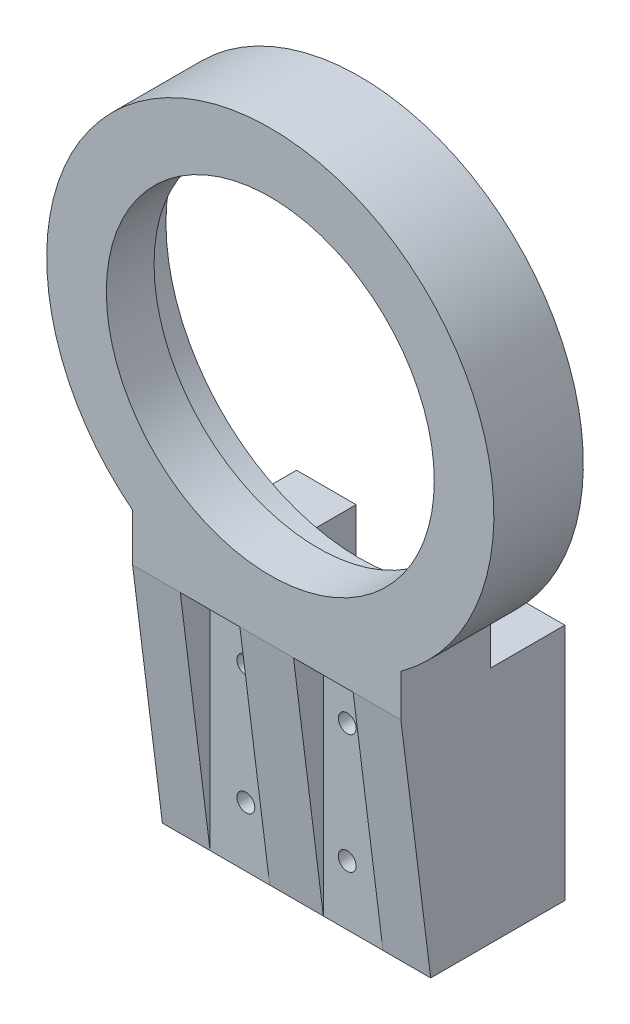
ISO-10303-21;
HEADER;
FILE_DESCRIPTION(('STEP AP214'),'2;1');
FILE_NAME('part.step','',(''),(''),'','','');
FILE_SCHEMA(('AUTOMOTIVE_DESIGN { 1 0 10303 214 1 1 1 1 }'));
ENDSEC;
DATA;
#1=APPLICATION_CONTEXT('core data for automotive mechanical design processes');
#2=APPLICATION_PROTOCOL_DEFINITION('international standard','automotive_design',2000,#1);
#3=PRODUCT_CONTEXT('',#1,'mechanical');
#4=PRODUCT('Part','Part','',(#3));
#5=PRODUCT_RELATED_PRODUCT_CATEGORY('part','',(#4));
#6=PRODUCT_DEFINITION_FORMATION('','',#4);
#7=PRODUCT_DEFINITION_CONTEXT('part definition',#1,'design');
#8=PRODUCT_DEFINITION('design','',#6,#7);
#9=PRODUCT_DEFINITION_SHAPE('','',#8);
#10=(LENGTH_UNIT() NAMED_UNIT(*) SI_UNIT(.MILLI.,.METRE.));
#11=(NAMED_UNIT(*) PLANE_ANGLE_UNIT() SI_UNIT($,.RADIAN.));
#12=(NAMED_UNIT(*) SI_UNIT($,.STERADIAN.) SOLID_ANGLE_UNIT());
#13=UNCERTAINTY_MEASURE_WITH_UNIT(LENGTH_MEASURE(1.E-05),#10,'distance_accuracy_value','');
#14=(GEOMETRIC_REPRESENTATION_CONTEXT(3) GLOBAL_UNCERTAINTY_ASSIGNED_CONTEXT((#13)) GLOBAL_UNIT_ASSIGNED_CONTEXT((#10,
#11,#12)) REPRESENTATION_CONTEXT('',''));
#15=CARTESIAN_POINT('',(0.,0.,0.));
#16=DIRECTION('',(0.,0.,1.));
#17=DIRECTION('',(1.,0.,0.));
#18=AXIS2_PLACEMENT_3D('',#15,#16,#17);
#19=CARTESIAN_POINT('',(0.,0.,0.));
#20=DIRECTION('',(0.,0.,1.));
#21=DIRECTION('',(1.,0.,0.));
#22=AXIS2_PLACEMENT_3D('',#19,#20,#21);
#23=PLANE('',#22);
#24=CARTESIAN_POINT('',(7.89839646309968,-47.5,0.));
#25=DIRECTION('',(0.,0.,1.));
#26=DIRECTION('',(1.,0.,0.));
#27=AXIS2_PLACEMENT_3D('',#24,#25,#26);
#28=CIRCLE('',#27,1.5);
#29=CARTESIAN_POINT('',(9.39839646309968,-47.5,0.));
#30=VERTEX_POINT('',#29);
#31=EDGE_CURVE('E642',#30,#30,#28,.T.);
#32=ORIENTED_EDGE('',*,*,#31,.T.);
#33=EDGE_LOOP('',(#32));
#34=FACE_BOUND('',#33,.T.);
#35=CARTESIAN_POINT('',(7.89839646309968,-67.5,0.));
#36=DIRECTION('',(0.,0.,1.));
#37=DIRECTION('',(1.,0.,0.));
#38=AXIS2_PLACEMENT_3D('',#35,#36,#37);
#39=CIRCLE('',#38,1.5);
#40=CARTESIAN_POINT('',(9.39839646309968,-67.5,0.));
#41=VERTEX_POINT('',#40);
#42=EDGE_CURVE('E670',#41,#41,#39,.T.);
#43=ORIENTED_EDGE('',*,*,#42,.T.);
#44=EDGE_LOOP('',(#43));
#45=FACE_BOUND('',#44,.T.);
#46=CARTESIAN_POINT('',(-9.10160353690032,-67.5,0.));
#47=DIRECTION('',(0.,0.,1.));
#48=DIRECTION('',(1.,0.,0.));
#49=AXIS2_PLACEMENT_3D('',#46,#47,#48);
#50=CIRCLE('',#49,1.5);
#51=CARTESIAN_POINT('',(-7.60160353690032,-67.5,0.));
#52=VERTEX_POINT('',#51);
#53=EDGE_CURVE('E657',#52,#52,#50,.T.);
#54=ORIENTED_EDGE('',*,*,#53,.T.);
#55=EDGE_LOOP('',(#54));
#56=FACE_BOUND('',#55,.T.);
#57=CARTESIAN_POINT('',(-9.10160353690032,-47.5,0.));
#58=DIRECTION('',(0.,0.,1.));
#59=DIRECTION('',(1.,0.,0.));
#60=AXIS2_PLACEMENT_3D('',#57,#58,#59);
#61=CIRCLE('',#60,1.5);
#62=CARTESIAN_POINT('',(-7.60160353690032,-47.5,0.));
#63=VERTEX_POINT('',#62);
#64=EDGE_CURVE('E652',#63,#63,#61,.T.);
#65=ORIENTED_EDGE('',*,*,#64,.T.);
#66=EDGE_LOOP('',(#65));
#67=FACE_BOUND('',#66,.T.);
#68=CARTESIAN_POINT('',(0.,0.,0.));
#69=DIRECTION('',(0.,0.,-1.));
#70=DIRECTION('',(-1.,0.,0.));
#71=AXIS2_PLACEMENT_3D('',#68,#69,#70);
#72=CIRCLE('',#71,32.5);
#73=CARTESIAN_POINT('',(-32.5,0.,0.));
#74=VERTEX_POINT('',#73);
#75=EDGE_CURVE('E262',#74,#74,#72,.T.);
#76=ORIENTED_EDGE('',*,*,#75,.F.);
#77=EDGE_LOOP('',(#76));
#78=FACE_BOUND('',#77,.T.);
#79=DIRECTION('',(1.,0.,0.));
#80=VECTOR('',#79,1.);
#81=CARTESIAN_POINT('',(-23.1016035369003,-37.5,0.));
#82=LINE('',#81,#80);
#83=CARTESIAN_POINT('',(-23.1016035369003,-37.5,0.));
#84=VERTEX_POINT('',#83);
#85=CARTESIAN_POINT('',(-13.1016035369003,-37.5,0.));
#86=VERTEX_POINT('',#85);
#87=EDGE_CURVE('E393',#84,#86,#82,.T.);
#88=ORIENTED_EDGE('',*,*,#87,.F.);
#89=DIRECTION('',(0.,1.,0.));
#90=VECTOR('',#89,1.);
#91=CARTESIAN_POINT('',(-23.1016035369003,0.,0.));
#92=LINE('',#91,#90);
#93=CARTESIAN_POINT('',(-23.1016035369003,-29.5392266998287,0.));
#94=VERTEX_POINT('',#93);
#95=EDGE_CURVE('E177',#84,#94,#92,.T.);
#96=ORIENTED_EDGE('',*,*,#95,.T.);
#97=CARTESIAN_POINT('',(0.,0.,0.));
#98=DIRECTION('',(0.,0.,1.));
#99=DIRECTION('',(1.,0.,0.));
#100=AXIS2_PLACEMENT_3D('',#97,#98,#99);
#101=CIRCLE('',#100,37.5);
#102=CARTESIAN_POINT('',(21.8983964630997,-30.4419157141088,0.));
#103=VERTEX_POINT('',#102);
#104=EDGE_CURVE('E266',#103,#94,#101,.T.);
#105=ORIENTED_EDGE('',*,*,#104,.F.);
#106=DIRECTION('',(0.,1.,0.));
#107=VECTOR('',#106,1.);
#108=CARTESIAN_POINT('',(21.8983964630997,0.,0.));
#109=LINE('',#108,#107);
#110=CARTESIAN_POINT('',(21.8983964630997,-37.5,0.));
#111=VERTEX_POINT('',#110);
#112=EDGE_CURVE('E273',#111,#103,#109,.T.);
#113=ORIENTED_EDGE('',*,*,#112,.F.);
#114=DIRECTION('',(1.,0.,0.));
#115=VECTOR('',#114,1.);
#116=CARTESIAN_POINT('',(21.8983964630997,-37.5,0.));
#117=LINE('',#116,#115);
#118=CARTESIAN_POINT('',(11.8983964630997,-37.5,0.));
#119=VERTEX_POINT('',#118);
#120=EDGE_CURVE('E181',#119,#111,#117,.T.);
#121=ORIENTED_EDGE('',*,*,#120,.F.);
#122=DIRECTION('',(0.,1.,0.));
#123=VECTOR('',#122,1.);
#124=CARTESIAN_POINT('',(11.8983964630997,-77.5,0.));
#125=LINE('',#124,#123);
#126=CARTESIAN_POINT('',(11.8983964630997,-77.5,0.));
#127=VERTEX_POINT('',#126);
#128=EDGE_CURVE('E178',#127,#119,#125,.T.);
#129=ORIENTED_EDGE('',*,*,#128,.F.);
#130=DIRECTION('',(1.,0.,0.));
#131=VECTOR('',#130,1.);
#132=CARTESIAN_POINT('',(0.,-77.5,0.));
#133=LINE('',#132,#131);
#134=CARTESIAN_POINT('',(-13.1016035369003,-77.5,0.));
#135=VERTEX_POINT('',#134);
#136=EDGE_CURVE('E54',#135,#127,#133,.T.);
#137=ORIENTED_EDGE('',*,*,#136,.F.);
#138=DIRECTION('',(0.,-1.,0.));
#139=VECTOR('',#138,1.);
#140=CARTESIAN_POINT('',(-13.1016035369003,-77.5,0.));
#141=LINE('',#140,#139);
#142=EDGE_CURVE('E171',#86,#135,#141,.T.);
#143=ORIENTED_EDGE('',*,*,#142,.F.);
#144=EDGE_LOOP('',(#88,#96,#105,#113,#121,#129,#137,#143));
#145=FACE_BOUND('',#144,.T.);
#146=ADVANCED_FACE('F34',(#34,#45,#56,#67,#78,#145),#23,.F.);
#147=CARTESIAN_POINT('',(21.8983964630997,-37.5,15.));
#148=DIRECTION('',(0.,-0.124034734589208,0.992277876713668));
#149=DIRECTION('',(0.,-0.992277876713668,-0.124034734589208));
#150=AXIS2_PLACEMENT_3D('',#147,#148,#149);
#151=PLANE('',#150);
#152=DIRECTION('',(0.,-0.992277876713668,-0.124034734589208));
#153=VECTOR('',#152,1.);
#154=CARTESIAN_POINT('',(-15.1016035369003,-37.5,15.));
#155=LINE('',#154,#153);
#156=CARTESIAN_POINT('',(-15.1016035369003,-37.5,15.));
#157=VERTEX_POINT('',#156);
#158=CARTESIAN_POINT('',(-15.1016035369003,-77.5,10.));
#159=VERTEX_POINT('',#158);
#160=EDGE_CURVE('E11',#157,#159,#155,.T.);
#161=ORIENTED_EDGE('',*,*,#160,.F.);
#162=DIRECTION('',(1.,0.,0.));
#163=VECTOR('',#162,1.);
#164=CARTESIAN_POINT('',(-23.1016035369003,-37.5,15.));
#165=LINE('',#164,#163);
#166=CARTESIAN_POINT('',(-23.1016035369003,-37.5,15.));
#167=VERTEX_POINT('',#166);
#168=EDGE_CURVE('E250',#167,#157,#165,.T.);
#169=ORIENTED_EDGE('',*,*,#168,.F.);
#170=DIRECTION('',(0.,0.992277876713668,0.124034734589208));
#171=VECTOR('',#170,1.);
#172=CARTESIAN_POINT('',(-23.1016035369003,-37.5,15.));
#173=LINE('',#172,#171);
#174=CARTESIAN_POINT('',(-23.1016035369003,-77.5,10.));
#175=VERTEX_POINT('',#174);
#176=EDGE_CURVE('E226',#175,#167,#173,.T.);
#177=ORIENTED_EDGE('',*,*,#176,.F.);
#178=DIRECTION('',(1.,0.,0.));
#179=VECTOR('',#178,1.);
#180=CARTESIAN_POINT('',(-23.1016035369003,-77.5,10.));
#181=LINE('',#180,#179);
#182=EDGE_CURVE('E256',#175,#159,#181,.T.);
#183=ORIENTED_EDGE('',*,*,#182,.T.);
#184=EDGE_LOOP('',(#161,#169,#177,#183));
#185=FACE_BOUND('',#184,.T.);
#186=ADVANCED_FACE('F321',(#185),#151,.T.);
#187=DIRECTION('',(0.,0.992277876713668,0.124034734589208));
#188=VECTOR('',#187,1.);
#189=CARTESIAN_POINT('',(-5.10160353690032,-37.5,15.));
#190=LINE('',#189,#188);
#191=CARTESIAN_POINT('',(-5.10160353690031,-77.5,10.));
#192=VERTEX_POINT('',#191);
#193=CARTESIAN_POINT('',(-5.10160353690032,-37.5,15.));
#194=VERTEX_POINT('',#193);
#195=EDGE_CURVE('E42',#192,#194,#190,.T.);
#196=ORIENTED_EDGE('',*,*,#195,.F.);
#197=CARTESIAN_POINT('',(3.89839646309969,-77.5,10.));
#198=VERTEX_POINT('',#197);
#199=EDGE_CURVE('E259',#192,#198,#181,.T.);
#200=ORIENTED_EDGE('',*,*,#199,.T.);
#201=DIRECTION('',(0.,-0.992277876713668,-0.124034734589208));
#202=VECTOR('',#201,1.);
#203=CARTESIAN_POINT('',(3.89839646309968,-37.5,15.));
#204=LINE('',#203,#202);
#205=CARTESIAN_POINT('',(3.89839646309968,-37.5,15.));
#206=VERTEX_POINT('',#205);
#207=EDGE_CURVE('E297',#206,#198,#204,.T.);
#208=ORIENTED_EDGE('',*,*,#207,.F.);
#209=EDGE_CURVE('E254',#194,#206,#165,.T.);
#210=ORIENTED_EDGE('',*,*,#209,.F.);
#211=EDGE_LOOP('',(#196,#200,#208,#210));
#212=FACE_BOUND('',#211,.T.);
#213=ADVANCED_FACE('F309',(#212),#151,.T.);
#214=CARTESIAN_POINT('',(0.,0.,15.));
#215=DIRECTION('',(0.,0.,-1.));
#216=DIRECTION('',(-1.,0.,0.));
#217=AXIS2_PLACEMENT_3D('',#214,#215,#216);
#218=CYLINDRICAL_SURFACE('',#217,27.5);
#219=CARTESIAN_POINT('',(0.,0.,15.));
#220=DIRECTION('',(0.,0.,1.));
#221=DIRECTION('',(1.,0.,0.));
#222=AXIS2_PLACEMENT_3D('',#219,#220,#221);
#223=CIRCLE('',#222,27.5);
#224=CARTESIAN_POINT('',(27.5,0.,15.));
#225=VERTEX_POINT('',#224);
#226=EDGE_CURVE('E277',#225,#225,#223,.T.);
#227=ORIENTED_EDGE('',*,*,#226,.T.);
#228=EDGE_LOOP('',(#227));
#229=FACE_BOUND('',#228,.T.);
#230=CARTESIAN_POINT('',(0.,0.,7.));
#231=DIRECTION('',(0.,0.,-1.));
#232=DIRECTION('',(-1.,0.,0.));
#233=AXIS2_PLACEMENT_3D('',#230,#231,#232);
#234=CIRCLE('',#233,27.5);
#235=CARTESIAN_POINT('',(-27.5,0.,7.));
#236=VERTEX_POINT('',#235);
#237=EDGE_CURVE('E253',#236,#236,#234,.T.);
#238=ORIENTED_EDGE('',*,*,#237,.T.);
#239=EDGE_LOOP('',(#238));
#240=FACE_BOUND('',#239,.T.);
#241=ADVANCED_FACE('F376',(#229,#240),#218,.F.);
#242=CARTESIAN_POINT('',(0.,0.,15.));
#243=DIRECTION('',(0.,0.,-1.));
#244=DIRECTION('',(-1.,0.,0.));
#245=AXIS2_PLACEMENT_3D('',#242,#243,#244);
#246=CYLINDRICAL_SURFACE('',#245,37.5);
#247=ORIENTED_EDGE('',*,*,#104,.T.);
#248=DIRECTION('',(0.,0.,-1.));
#249=VECTOR('',#248,1.);
#250=CARTESIAN_POINT('',(-23.1016035369003,-29.5392266998287,15.));
#251=LINE('',#250,#249);
#252=CARTESIAN_POINT('',(-23.1016035369003,-29.5392266998287,15.));
#253=VERTEX_POINT('',#252);
#254=EDGE_CURVE('E292',#253,#94,#251,.T.);
#255=ORIENTED_EDGE('',*,*,#254,.F.);
#256=CARTESIAN_POINT('',(0.,0.,15.));
#257=DIRECTION('',(0.,0.,1.));
#258=DIRECTION('',(1.,0.,0.));
#259=AXIS2_PLACEMENT_3D('',#256,#257,#258);
#260=CIRCLE('',#259,37.5);
#261=CARTESIAN_POINT('',(21.8983964630997,-30.4419157141088,15.));
#262=VERTEX_POINT('',#261);
#263=EDGE_CURVE('E269',#262,#253,#260,.T.);
#264=ORIENTED_EDGE('',*,*,#263,.F.);
#265=DIRECTION('',(0.,0.,-1.));
#266=VECTOR('',#265,1.);
#267=CARTESIAN_POINT('',(21.8983964630997,-30.4419157141088,15.));
#268=LINE('',#267,#266);
#269=EDGE_CURVE('E280',#262,#103,#268,.T.);
#270=ORIENTED_EDGE('',*,*,#269,.T.);
#271=EDGE_LOOP('',(#247,#255,#264,#270));
#272=FACE_BOUND('',#271,.T.);
#273=ADVANCED_FACE('F36',(#272),#246,.T.);
#274=CARTESIAN_POINT('',(-23.1016035369003,0.,15.));
#275=DIRECTION('',(-1.,0.,0.));
#276=DIRECTION('',(0.,0.,1.));
#277=AXIS2_PLACEMENT_3D('',#274,#275,#276);
#278=PLANE('',#277);
#279=ORIENTED_EDGE('',*,*,#176,.T.);
#280=DIRECTION('',(0.,1.,0.));
#281=VECTOR('',#280,1.);
#282=CARTESIAN_POINT('',(-23.1016035369003,0.,15.));
#283=LINE('',#282,#281);
#284=EDGE_CURVE('E272',#167,#253,#283,.T.);
#285=ORIENTED_EDGE('',*,*,#284,.T.);
#286=ORIENTED_EDGE('',*,*,#254,.T.);
#287=ORIENTED_EDGE('',*,*,#95,.F.);
#288=DIRECTION('',(0.,0.,1.));
#289=VECTOR('',#288,1.);
#290=CARTESIAN_POINT('',(-23.1016035369003,-37.5,-12.5));
#291=LINE('',#290,#289);
#292=CARTESIAN_POINT('',(-23.1016035369003,-37.5,-12.5));
#293=VERTEX_POINT('',#292);
#294=EDGE_CURVE('E156',#293,#84,#291,.T.);
#295=ORIENTED_EDGE('',*,*,#294,.F.);
#296=DIRECTION('',(0.,1.,0.));
#297=VECTOR('',#296,1.);
#298=CARTESIAN_POINT('',(-23.1016035369003,-77.5,-12.5));
#299=LINE('',#298,#297);
#300=CARTESIAN_POINT('',(-23.1016035369003,-77.5,-12.5));
#301=VERTEX_POINT('',#300);
#302=EDGE_CURVE('E163',#301,#293,#299,.T.);
#303=ORIENTED_EDGE('',*,*,#302,.F.);
#304=DIRECTION('',(0.,0.,-1.));
#305=VECTOR('',#304,1.);
#306=CARTESIAN_POINT('',(-23.1016035369003,-77.5,15.));
#307=LINE('',#306,#305);
#308=EDGE_CURVE('E290',#175,#301,#307,.T.);
#309=ORIENTED_EDGE('',*,*,#308,.F.);
#310=EDGE_LOOP('',(#279,#285,#286,#287,#295,#303,#309));
#311=FACE_BOUND('',#310,.T.);
#312=ADVANCED_FACE('F175',(#311),#278,.T.);
#313=CARTESIAN_POINT('',(0.,-77.5,15.));
#314=DIRECTION('',(0.,1.,0.));
#315=DIRECTION('',(0.,0.,1.));
#316=AXIS2_PLACEMENT_3D('',#313,#314,#315);
#317=PLANE('',#316);
#318=DIRECTION('',(0.,0.,-1.));
#319=VECTOR('',#318,1.);
#320=CARTESIAN_POINT('',(21.8983964630997,-77.5,15.));
#321=LINE('',#320,#319);
#322=CARTESIAN_POINT('',(21.8983964630997,-77.5,10.));
#323=VERTEX_POINT('',#322);
#324=CARTESIAN_POINT('',(21.8983964630997,-77.5,-12.5));
#325=VERTEX_POINT('',#324);
#326=EDGE_CURVE('E288',#323,#325,#321,.T.);
#327=ORIENTED_EDGE('',*,*,#326,.F.);
#328=CARTESIAN_POINT('',(13.8983964630997,-77.5,10.));
#329=VERTEX_POINT('',#328);
#330=EDGE_CURVE('E248',#329,#323,#181,.T.);
#331=ORIENTED_EDGE('',*,*,#330,.F.);
#332=DIRECTION('',(1.,0.,0.));
#333=VECTOR('',#332,1.);
#334=CARTESIAN_POINT('',(3.89839646309969,-77.5,10.));
#335=LINE('',#334,#333);
#336=EDGE_CURVE('E231',#198,#329,#335,.T.);
#337=ORIENTED_EDGE('',*,*,#336,.F.);
#338=ORIENTED_EDGE('',*,*,#199,.F.);
#339=DIRECTION('',(1.,0.,0.));
#340=VECTOR('',#339,1.);
#341=CARTESIAN_POINT('',(-15.1016035369003,-77.5,10.));
#342=LINE('',#341,#340);
#343=EDGE_CURVE('E210',#159,#192,#342,.T.);
#344=ORIENTED_EDGE('',*,*,#343,.F.);
#345=ORIENTED_EDGE('',*,*,#182,.F.);
#346=ORIENTED_EDGE('',*,*,#308,.T.);
#347=DIRECTION('',(-1.,0.,0.));
#348=VECTOR('',#347,1.);
#349=CARTESIAN_POINT('',(-23.1016035369003,-77.5,-12.5));
#350=LINE('',#349,#348);
#351=CARTESIAN_POINT('',(-13.1016035369003,-77.5,-12.5));
#352=VERTEX_POINT('',#351);
#353=EDGE_CURVE('E168',#352,#301,#350,.T.);
#354=ORIENTED_EDGE('',*,*,#353,.F.);
#355=DIRECTION('',(0.,0.,1.));
#356=VECTOR('',#355,1.);
#357=CARTESIAN_POINT('',(-13.1016035369003,-77.5,-12.5));
#358=LINE('',#357,#356);
#359=EDGE_CURVE('E49',#352,#135,#358,.T.);
#360=ORIENTED_EDGE('',*,*,#359,.T.);
#361=ORIENTED_EDGE('',*,*,#136,.T.);
#362=DIRECTION('',(0.,0.,1.));
#363=VECTOR('',#362,1.);
#364=CARTESIAN_POINT('',(11.8983964630997,-77.5,-12.5));
#365=LINE('',#364,#363);
#366=CARTESIAN_POINT('',(11.8983964630997,-77.5,-12.5));
#367=VERTEX_POINT('',#366);
#368=EDGE_CURVE('E203',#367,#127,#365,.T.);
#369=ORIENTED_EDGE('',*,*,#368,.F.);
#370=DIRECTION('',(-1.,0.,0.));
#371=VECTOR('',#370,1.);
#372=CARTESIAN_POINT('',(21.8983964630997,-77.5,-12.5));
#373=LINE('',#372,#371);
#374=EDGE_CURVE('E189',#325,#367,#373,.T.);
#375=ORIENTED_EDGE('',*,*,#374,.F.);
#376=EDGE_LOOP('',(#327,#331,#337,#338,#344,#345,#346,#354,#360,#361,#369,#375));
#377=FACE_BOUND('',#376,.T.);
#378=ADVANCED_FACE('F329',(#377),#317,.F.);
#379=CARTESIAN_POINT('',(21.8983964630997,0.,15.));
#380=DIRECTION('',(-1.,0.,0.));
#381=DIRECTION('',(0.,0.,1.));
#382=AXIS2_PLACEMENT_3D('',#379,#380,#381);
#383=PLANE('',#382);
#384=DIRECTION('',(0.,1.,0.));
#385=VECTOR('',#384,1.);
#386=CARTESIAN_POINT('',(21.8983964630997,0.,15.));
#387=LINE('',#386,#385);
#388=CARTESIAN_POINT('',(21.8983964630997,-37.5,15.));
#389=VERTEX_POINT('',#388);
#390=EDGE_CURVE('E275',#389,#262,#387,.T.);
#391=ORIENTED_EDGE('',*,*,#390,.F.);
#392=DIRECTION('',(0.,0.992277876713668,0.124034734589208));
#393=VECTOR('',#392,1.);
#394=CARTESIAN_POINT('',(21.8983964630997,-37.5,15.));
#395=LINE('',#394,#393);
#396=EDGE_CURVE('E245',#323,#389,#395,.T.);
#397=ORIENTED_EDGE('',*,*,#396,.F.);
#398=ORIENTED_EDGE('',*,*,#326,.T.);
#399=DIRECTION('',(0.,-1.,0.));
#400=VECTOR('',#399,1.);
#401=CARTESIAN_POINT('',(21.8983964630997,-77.5,-12.5));
#402=LINE('',#401,#400);
#403=CARTESIAN_POINT('',(21.8983964630997,-37.5,-12.5));
#404=VERTEX_POINT('',#403);
#405=EDGE_CURVE('E186',#404,#325,#402,.T.);
#406=ORIENTED_EDGE('',*,*,#405,.F.);
#407=DIRECTION('',(0.,0.,1.));
#408=VECTOR('',#407,1.);
#409=CARTESIAN_POINT('',(21.8983964630997,-37.5,-12.5));
#410=LINE('',#409,#408);
#411=EDGE_CURVE('E194',#404,#111,#410,.T.);
#412=ORIENTED_EDGE('',*,*,#411,.T.);
#413=ORIENTED_EDGE('',*,*,#112,.T.);
#414=ORIENTED_EDGE('',*,*,#269,.F.);
#415=EDGE_LOOP('',(#391,#397,#398,#406,#412,#413,#414));
#416=FACE_BOUND('',#415,.T.);
#417=ADVANCED_FACE('F339',(#416),#383,.F.);
#418=CARTESIAN_POINT('',(0.,0.,15.));
#419=DIRECTION('',(0.,0.,1.));
#420=DIRECTION('',(1.,0.,0.));
#421=AXIS2_PLACEMENT_3D('',#418,#419,#420);
#422=PLANE('',#421);
#423=ORIENTED_EDGE('',*,*,#168,.T.);
#424=DIRECTION('',(-1.,0.,0.));
#425=VECTOR('',#424,1.);
#426=CARTESIAN_POINT('',(-15.1016035369003,-37.5,15.));
#427=LINE('',#426,#425);
#428=EDGE_CURVE('E211',#194,#157,#427,.T.);
#429=ORIENTED_EDGE('',*,*,#428,.F.);
#430=ORIENTED_EDGE('',*,*,#209,.T.);
#431=DIRECTION('',(-1.,0.,0.));
#432=VECTOR('',#431,1.);
#433=CARTESIAN_POINT('',(3.89839646309968,-37.5,15.));
#434=LINE('',#433,#432);
#435=CARTESIAN_POINT('',(13.8983964630997,-37.5,15.));
#436=VERTEX_POINT('',#435);
#437=EDGE_CURVE('E206',#436,#206,#434,.T.);
#438=ORIENTED_EDGE('',*,*,#437,.F.);
#439=EDGE_CURVE('E255',#436,#389,#165,.T.);
#440=ORIENTED_EDGE('',*,*,#439,.T.);
#441=ORIENTED_EDGE('',*,*,#390,.T.);
#442=ORIENTED_EDGE('',*,*,#263,.T.);
#443=ORIENTED_EDGE('',*,*,#284,.F.);
#444=EDGE_LOOP('',(#423,#429,#430,#438,#440,#441,#442,#443));
#445=FACE_BOUND('',#444,.T.);
#446=ORIENTED_EDGE('',*,*,#226,.F.);
#447=EDGE_LOOP('',(#446));
#448=FACE_BOUND('',#447,.T.);
#449=ADVANCED_FACE('F312',(#445,#448),#422,.T.);
#450=CARTESIAN_POINT('',(0.,0.,7.));
#451=DIRECTION('',(0.,0.,-1.));
#452=DIRECTION('',(-1.,0.,0.));
#453=AXIS2_PLACEMENT_3D('',#450,#451,#452);
#454=CYLINDRICAL_SURFACE('',#453,32.5);
#455=CARTESIAN_POINT('',(0.,0.,7.));
#456=DIRECTION('',(0.,0.,-1.));
#457=DIRECTION('',(-1.,0.,0.));
#458=AXIS2_PLACEMENT_3D('',#455,#456,#457);
#459=CIRCLE('',#458,32.5);
#460=CARTESIAN_POINT('',(-32.5,0.,7.));
#461=VERTEX_POINT('',#460);
#462=EDGE_CURVE('E263',#461,#461,#459,.T.);
#463=ORIENTED_EDGE('',*,*,#462,.F.);
#464=EDGE_LOOP('',(#463));
#465=FACE_BOUND('',#464,.T.);
#466=ORIENTED_EDGE('',*,*,#75,.T.);
#467=EDGE_LOOP('',(#466));
#468=FACE_BOUND('',#467,.T.);
#469=ADVANCED_FACE('F415',(#465,#468),#454,.F.);
#470=CARTESIAN_POINT('',(0.,0.,7.));
#471=DIRECTION('',(0.,0.,-1.));
#472=DIRECTION('',(-1.,0.,0.));
#473=AXIS2_PLACEMENT_3D('',#470,#471,#472);
#474=PLANE('',#473);
#475=ORIENTED_EDGE('',*,*,#237,.F.);
#476=EDGE_LOOP('',(#475));
#477=FACE_BOUND('',#476,.T.);
#478=ORIENTED_EDGE('',*,*,#462,.T.);
#479=EDGE_LOOP('',(#478));
#480=FACE_BOUND('',#479,.T.);
#481=ADVANCED_FACE('F411',(#477,#480),#474,.T.);
#482=DIRECTION('',(0.,0.992277876713668,0.124034734589208));
#483=VECTOR('',#482,1.);
#484=CARTESIAN_POINT('',(13.8983964630997,-37.5,15.));
#485=LINE('',#484,#483);
#486=EDGE_CURVE('E294',#329,#436,#485,.T.);
#487=ORIENTED_EDGE('',*,*,#486,.F.);
#488=ORIENTED_EDGE('',*,*,#330,.T.);
#489=ORIENTED_EDGE('',*,*,#396,.T.);
#490=ORIENTED_EDGE('',*,*,#439,.F.);
#491=EDGE_LOOP('',(#487,#488,#489,#490));
#492=FACE_BOUND('',#491,.T.);
#493=ADVANCED_FACE('F335',(#492),#151,.T.);
#494=CARTESIAN_POINT('',(3.89839646309968,-37.5,10.));
#495=DIRECTION('',(-1.,0.,0.));
#496=DIRECTION('',(0.,-1.,0.));
#497=AXIS2_PLACEMENT_3D('',#494,#495,#496);
#498=PLANE('',#497);
#499=ORIENTED_EDGE('',*,*,#207,.T.);
#500=DIRECTION('',(0.,-1.,0.));
#501=VECTOR('',#500,1.);
#502=CARTESIAN_POINT('',(3.89839646309968,-37.5,10.));
#503=LINE('',#502,#501);
#504=CARTESIAN_POINT('',(3.89839646309968,-37.5,10.));
#505=VERTEX_POINT('',#504);
#506=EDGE_CURVE('E228',#505,#198,#503,.T.);
#507=ORIENTED_EDGE('',*,*,#506,.F.);
#508=DIRECTION('',(0.,0.,1.));
#509=VECTOR('',#508,1.);
#510=CARTESIAN_POINT('',(3.89839646309968,-37.5,10.));
#511=LINE('',#510,#509);
#512=EDGE_CURVE('E223',#505,#206,#511,.T.);
#513=ORIENTED_EDGE('',*,*,#512,.T.);
#514=EDGE_LOOP('',(#499,#507,#513));
#515=FACE_BOUND('',#514,.T.);
#516=ADVANCED_FACE('F403',(#515),#498,.F.);
#517=CARTESIAN_POINT('',(3.89839646309968,-37.5,10.));
#518=DIRECTION('',(0.,1.,0.));
#519=DIRECTION('',(0.,0.,1.));
#520=AXIS2_PLACEMENT_3D('',#517,#518,#519);
#521=PLANE('',#520);
#522=ORIENTED_EDGE('',*,*,#437,.T.);
#523=ORIENTED_EDGE('',*,*,#512,.F.);
#524=DIRECTION('',(-1.,0.,0.));
#525=VECTOR('',#524,1.);
#526=CARTESIAN_POINT('',(3.89839646309968,-37.5,10.));
#527=LINE('',#526,#525);
#528=CARTESIAN_POINT('',(13.8983964630997,-37.5,10.));
#529=VERTEX_POINT('',#528);
#530=EDGE_CURVE('E237',#529,#505,#527,.T.);
#531=ORIENTED_EDGE('',*,*,#530,.F.);
#532=DIRECTION('',(0.,0.,1.));
#533=VECTOR('',#532,1.);
#534=CARTESIAN_POINT('',(13.8983964630997,-37.5,10.));
#535=LINE('',#534,#533);
#536=EDGE_CURVE('E240',#529,#436,#535,.T.);
#537=ORIENTED_EDGE('',*,*,#536,.T.);
#538=EDGE_LOOP('',(#522,#523,#531,#537));
#539=FACE_BOUND('',#538,.T.);
#540=ADVANCED_FACE('F395',(#539),#521,.F.);
#541=CARTESIAN_POINT('',(13.8983964630997,-37.5,10.));
#542=DIRECTION('',(1.,0.,0.));
#543=DIRECTION('',(0.,1.,0.));
#544=AXIS2_PLACEMENT_3D('',#541,#542,#543);
#545=PLANE('',#544);
#546=ORIENTED_EDGE('',*,*,#486,.T.);
#547=ORIENTED_EDGE('',*,*,#536,.F.);
#548=DIRECTION('',(0.,1.,0.));
#549=VECTOR('',#548,1.);
#550=CARTESIAN_POINT('',(13.8983964630997,-37.5,10.));
#551=LINE('',#550,#549);
#552=EDGE_CURVE('E234',#329,#529,#551,.T.);
#553=ORIENTED_EDGE('',*,*,#552,.F.);
#554=EDGE_LOOP('',(#546,#547,#553));
#555=FACE_BOUND('',#554,.T.);
#556=ADVANCED_FACE('F399',(#555),#545,.F.);
#557=CARTESIAN_POINT('',(0.,0.,10.));
#558=DIRECTION('',(0.,0.,1.));
#559=DIRECTION('',(1.,0.,0.));
#560=AXIS2_PLACEMENT_3D('',#557,#558,#559);
#561=PLANE('',#560);
#562=CARTESIAN_POINT('',(7.89839646309968,-47.5,10.));
#563=DIRECTION('',(0.,0.,1.));
#564=DIRECTION('',(1.,0.,0.));
#565=AXIS2_PLACEMENT_3D('',#562,#563,#564);
#566=CIRCLE('',#565,1.5);
#567=CARTESIAN_POINT('',(9.39839646309968,-47.5,10.));
#568=VERTEX_POINT('',#567);
#569=EDGE_CURVE('E645',#568,#568,#566,.T.);
#570=ORIENTED_EDGE('',*,*,#569,.F.);
#571=EDGE_LOOP('',(#570));
#572=FACE_BOUND('',#571,.T.);
#573=CARTESIAN_POINT('',(7.89839646309968,-67.5,10.));
#574=DIRECTION('',(0.,0.,1.));
#575=DIRECTION('',(1.,0.,0.));
#576=AXIS2_PLACEMENT_3D('',#573,#574,#575);
#577=CIRCLE('',#576,1.5);
#578=CARTESIAN_POINT('',(9.39839646309968,-67.5,10.));
#579=VERTEX_POINT('',#578);
#580=EDGE_CURVE('E648',#579,#579,#577,.T.);
#581=ORIENTED_EDGE('',*,*,#580,.F.);
#582=EDGE_LOOP('',(#581));
#583=FACE_BOUND('',#582,.T.);
#584=ORIENTED_EDGE('',*,*,#506,.T.);
#585=ORIENTED_EDGE('',*,*,#336,.T.);
#586=ORIENTED_EDGE('',*,*,#552,.T.);
#587=ORIENTED_EDGE('',*,*,#530,.T.);
#588=EDGE_LOOP('',(#584,#585,#586,#587));
#589=FACE_BOUND('',#588,.T.);
#590=ADVANCED_FACE('F401',(#572,#583,#589),#561,.T.);
#591=CARTESIAN_POINT('',(-15.1016035369003,-37.5,10.));
#592=DIRECTION('',(-1.,0.,0.));
#593=DIRECTION('',(0.,-1.,0.));
#594=AXIS2_PLACEMENT_3D('',#591,#592,#593);
#595=PLANE('',#594);
#596=ORIENTED_EDGE('',*,*,#160,.T.);
#597=DIRECTION('',(0.,-1.,0.));
#598=VECTOR('',#597,1.);
#599=CARTESIAN_POINT('',(-15.1016035369003,-37.5,10.));
#600=LINE('',#599,#598);
#601=CARTESIAN_POINT('',(-15.1016035369003,-37.5,10.));
#602=VERTEX_POINT('',#601);
#603=EDGE_CURVE('E207',#602,#159,#600,.T.);
#604=ORIENTED_EDGE('',*,*,#603,.F.);
#605=DIRECTION('',(0.,0.,1.));
#606=VECTOR('',#605,1.);
#607=CARTESIAN_POINT('',(-15.1016035369003,-37.5,10.));
#608=LINE('',#607,#606);
#609=EDGE_CURVE('E224',#602,#157,#608,.T.);
#610=ORIENTED_EDGE('',*,*,#609,.T.);
#611=EDGE_LOOP('',(#596,#604,#610));
#612=FACE_BOUND('',#611,.T.);
#613=ADVANCED_FACE('F324',(#612),#595,.F.);
#614=CARTESIAN_POINT('',(-15.1016035369003,-37.5,10.));
#615=DIRECTION('',(0.,1.,0.));
#616=DIRECTION('',(0.,0.,1.));
#617=AXIS2_PLACEMENT_3D('',#614,#615,#616);
#618=PLANE('',#617);
#619=ORIENTED_EDGE('',*,*,#428,.T.);
#620=ORIENTED_EDGE('',*,*,#609,.F.);
#621=DIRECTION('',(-1.,0.,0.));
#622=VECTOR('',#621,1.);
#623=CARTESIAN_POINT('',(-15.1016035369003,-37.5,10.));
#624=LINE('',#623,#622);
#625=CARTESIAN_POINT('',(-5.10160353690032,-37.5,10.));
#626=VERTEX_POINT('',#625);
#627=EDGE_CURVE('E217',#626,#602,#624,.T.);
#628=ORIENTED_EDGE('',*,*,#627,.F.);
#629=DIRECTION('',(0.,0.,1.));
#630=VECTOR('',#629,1.);
#631=CARTESIAN_POINT('',(-5.10160353690032,-37.5,10.));
#632=LINE('',#631,#630);
#633=EDGE_CURVE('E220',#626,#194,#632,.T.);
#634=ORIENTED_EDGE('',*,*,#633,.T.);
#635=EDGE_LOOP('',(#619,#620,#628,#634));
#636=FACE_BOUND('',#635,.T.);
#637=ADVANCED_FACE('F317',(#636),#618,.F.);
#638=CARTESIAN_POINT('',(-5.10160353690032,-37.5,10.));
#639=DIRECTION('',(1.,0.,0.));
#640=DIRECTION('',(0.,1.,0.));
#641=AXIS2_PLACEMENT_3D('',#638,#639,#640);
#642=PLANE('',#641);
#643=ORIENTED_EDGE('',*,*,#195,.T.);
#644=ORIENTED_EDGE('',*,*,#633,.F.);
#645=DIRECTION('',(0.,1.,0.));
#646=VECTOR('',#645,1.);
#647=CARTESIAN_POINT('',(-5.10160353690032,-37.5,10.));
#648=LINE('',#647,#646);
#649=EDGE_CURVE('E214',#192,#626,#648,.T.);
#650=ORIENTED_EDGE('',*,*,#649,.F.);
#651=EDGE_LOOP('',(#643,#644,#650));
#652=FACE_BOUND('',#651,.T.);
#653=ADVANCED_FACE('F302',(#652),#642,.F.);
#654=CARTESIAN_POINT('',(0.,0.,10.));
#655=DIRECTION('',(0.,0.,1.));
#656=DIRECTION('',(1.,0.,0.));
#657=AXIS2_PLACEMENT_3D('',#654,#655,#656);
#658=PLANE('',#657);
#659=CARTESIAN_POINT('',(-9.10160353690032,-67.5,10.));
#660=DIRECTION('',(0.,0.,1.));
#661=DIRECTION('',(1.,0.,0.));
#662=AXIS2_PLACEMENT_3D('',#659,#660,#661);
#663=CIRCLE('',#662,1.5);
#664=CARTESIAN_POINT('',(-7.60160353690032,-67.5,10.));
#665=VERTEX_POINT('',#664);
#666=EDGE_CURVE('E665',#665,#665,#663,.T.);
#667=ORIENTED_EDGE('',*,*,#666,.F.);
#668=EDGE_LOOP('',(#667));
#669=FACE_BOUND('',#668,.T.);
#670=CARTESIAN_POINT('',(-9.10160353690032,-47.5,10.));
#671=DIRECTION('',(0.,0.,1.));
#672=DIRECTION('',(1.,0.,0.));
#673=AXIS2_PLACEMENT_3D('',#670,#671,#672);
#674=CIRCLE('',#673,1.5);
#675=CARTESIAN_POINT('',(-7.60160353690032,-47.5,10.));
#676=VERTEX_POINT('',#675);
#677=EDGE_CURVE('E655',#676,#676,#674,.T.);
#678=ORIENTED_EDGE('',*,*,#677,.F.);
#679=EDGE_LOOP('',(#678));
#680=FACE_BOUND('',#679,.T.);
#681=ORIENTED_EDGE('',*,*,#603,.T.);
#682=ORIENTED_EDGE('',*,*,#343,.T.);
#683=ORIENTED_EDGE('',*,*,#649,.T.);
#684=ORIENTED_EDGE('',*,*,#627,.T.);
#685=EDGE_LOOP('',(#681,#682,#683,#684));
#686=FACE_BOUND('',#685,.T.);
#687=ADVANCED_FACE('F327',(#669,#680,#686),#658,.T.);
#688=CARTESIAN_POINT('',(11.8983964630997,-77.5,-12.5));
#689=DIRECTION('',(1.,0.,0.));
#690=DIRECTION('',(0.,0.,-1.));
#691=AXIS2_PLACEMENT_3D('',#688,#689,#690);
#692=PLANE('',#691);
#693=ORIENTED_EDGE('',*,*,#128,.T.);
#694=DIRECTION('',(0.,0.,1.));
#695=VECTOR('',#694,1.);
#696=CARTESIAN_POINT('',(11.8983964630997,-37.5,-12.5));
#697=LINE('',#696,#695);
#698=CARTESIAN_POINT('',(11.8983964630997,-37.5,-12.5));
#699=VERTEX_POINT('',#698);
#700=EDGE_CURVE('E200',#699,#119,#697,.T.);
#701=ORIENTED_EDGE('',*,*,#700,.F.);
#702=DIRECTION('',(0.,1.,0.));
#703=VECTOR('',#702,1.);
#704=CARTESIAN_POINT('',(11.8983964630997,-77.5,-12.5));
#705=LINE('',#704,#703);
#706=EDGE_CURVE('E191',#367,#699,#705,.T.);
#707=ORIENTED_EDGE('',*,*,#706,.F.);
#708=ORIENTED_EDGE('',*,*,#368,.T.);
#709=EDGE_LOOP('',(#693,#701,#707,#708));
#710=FACE_BOUND('',#709,.T.);
#711=ADVANCED_FACE('F354',(#710),#692,.F.);
#712=CARTESIAN_POINT('',(21.8983964630997,-37.5,-12.5));
#713=DIRECTION('',(0.,-1.,0.));
#714=DIRECTION('',(0.,0.,-1.));
#715=AXIS2_PLACEMENT_3D('',#712,#713,#714);
#716=PLANE('',#715);
#717=ORIENTED_EDGE('',*,*,#120,.T.);
#718=ORIENTED_EDGE('',*,*,#411,.F.);
#719=DIRECTION('',(1.,0.,0.));
#720=VECTOR('',#719,1.);
#721=CARTESIAN_POINT('',(21.8983964630997,-37.5,-12.5));
#722=LINE('',#721,#720);
#723=EDGE_CURVE('E193',#699,#404,#722,.T.);
#724=ORIENTED_EDGE('',*,*,#723,.F.);
#725=ORIENTED_EDGE('',*,*,#700,.T.);
#726=EDGE_LOOP('',(#717,#718,#724,#725));
#727=FACE_BOUND('',#726,.T.);
#728=ADVANCED_FACE('F349',(#727),#716,.F.);
#729=CARTESIAN_POINT('',(0.,0.,-12.5));
#730=DIRECTION('',(0.,0.,1.));
#731=DIRECTION('',(1.,0.,0.));
#732=AXIS2_PLACEMENT_3D('',#729,#730,#731);
#733=PLANE('',#732);
#734=ORIENTED_EDGE('',*,*,#405,.T.);
#735=ORIENTED_EDGE('',*,*,#374,.T.);
#736=ORIENTED_EDGE('',*,*,#706,.T.);
#737=ORIENTED_EDGE('',*,*,#723,.T.);
#738=EDGE_LOOP('',(#734,#735,#736,#737));
#739=FACE_BOUND('',#738,.T.);
#740=ADVANCED_FACE('F345',(#739),#733,.F.);
#741=CARTESIAN_POINT('',(-23.1016035369003,-37.5,-12.5));
#742=DIRECTION('',(0.,-1.,0.));
#743=DIRECTION('',(0.,0.,-1.));
#744=AXIS2_PLACEMENT_3D('',#741,#742,#743);
#745=PLANE('',#744);
#746=ORIENTED_EDGE('',*,*,#87,.T.);
#747=DIRECTION('',(0.,0.,1.));
#748=VECTOR('',#747,1.);
#749=CARTESIAN_POINT('',(-13.1016035369003,-37.5,-12.5));
#750=LINE('',#749,#748);
#751=CARTESIAN_POINT('',(-13.1016035369003,-37.5,-12.5));
#752=VERTEX_POINT('',#751);
#753=EDGE_CURVE('E159',#752,#86,#750,.T.);
#754=ORIENTED_EDGE('',*,*,#753,.F.);
#755=DIRECTION('',(1.,0.,0.));
#756=VECTOR('',#755,1.);
#757=CARTESIAN_POINT('',(-23.1016035369003,-37.5,-12.5));
#758=LINE('',#757,#756);
#759=EDGE_CURVE('E152',#293,#752,#758,.T.);
#760=ORIENTED_EDGE('',*,*,#759,.F.);
#761=ORIENTED_EDGE('',*,*,#294,.T.);
#762=EDGE_LOOP('',(#746,#754,#760,#761));
#763=FACE_BOUND('',#762,.T.);
#764=ADVANCED_FACE('F154',(#763),#745,.F.);
#765=CARTESIAN_POINT('',(-13.1016035369003,-77.5,-12.5));
#766=DIRECTION('',(-1.,0.,0.));
#767=DIRECTION('',(0.,0.,1.));
#768=AXIS2_PLACEMENT_3D('',#765,#766,#767);
#769=PLANE('',#768);
#770=ORIENTED_EDGE('',*,*,#142,.T.);
#771=ORIENTED_EDGE('',*,*,#359,.F.);
#772=DIRECTION('',(0.,-1.,0.));
#773=VECTOR('',#772,1.);
#774=CARTESIAN_POINT('',(-13.1016035369003,-77.5,-12.5));
#775=LINE('',#774,#773);
#776=EDGE_CURVE('E162',#752,#352,#775,.T.);
#777=ORIENTED_EDGE('',*,*,#776,.F.);
#778=ORIENTED_EDGE('',*,*,#753,.T.);
#779=EDGE_LOOP('',(#770,#771,#777,#778));
#780=FACE_BOUND('',#779,.T.);
#781=ADVANCED_FACE('F577',(#780),#769,.F.);
#782=CARTESIAN_POINT('',(0.,0.,-12.5));
#783=DIRECTION('',(0.,0.,-1.));
#784=DIRECTION('',(-1.,0.,0.));
#785=AXIS2_PLACEMENT_3D('',#782,#783,#784);
#786=PLANE('',#785);
#787=ORIENTED_EDGE('',*,*,#302,.T.);
#788=ORIENTED_EDGE('',*,*,#759,.T.);
#789=ORIENTED_EDGE('',*,*,#776,.T.);
#790=ORIENTED_EDGE('',*,*,#353,.T.);
#791=EDGE_LOOP('',(#787,#788,#789,#790));
#792=FACE_BOUND('',#791,.T.);
#793=ADVANCED_FACE('F167',(#792),#786,.T.);
#794=CARTESIAN_POINT('',(-9.10160353690032,-47.5,0.));
#795=DIRECTION('',(0.,0.,1.));
#796=DIRECTION('',(1.,0.,0.));
#797=AXIS2_PLACEMENT_3D('',#794,#795,#796);
#798=CYLINDRICAL_SURFACE('',#797,1.5);
#799=ORIENTED_EDGE('',*,*,#64,.F.);
#800=EDGE_LOOP('',(#799));
#801=FACE_BOUND('',#800,.T.);
#802=ORIENTED_EDGE('',*,*,#677,.T.);
#803=EDGE_LOOP('',(#802));
#804=FACE_BOUND('',#803,.T.);
#805=ADVANCED_FACE('F593',(#801,#804),#798,.F.);
#806=CARTESIAN_POINT('',(-9.10160353690032,-67.5,0.));
#807=DIRECTION('',(0.,0.,1.));
#808=DIRECTION('',(1.,0.,0.));
#809=AXIS2_PLACEMENT_3D('',#806,#807,#808);
#810=CYLINDRICAL_SURFACE('',#809,1.5);
#811=ORIENTED_EDGE('',*,*,#53,.F.);
#812=EDGE_LOOP('',(#811));
#813=FACE_BOUND('',#812,.T.);
#814=ORIENTED_EDGE('',*,*,#666,.T.);
#815=EDGE_LOOP('',(#814));
#816=FACE_BOUND('',#815,.T.);
#817=ADVANCED_FACE('F601',(#813,#816),#810,.F.);
#818=CARTESIAN_POINT('',(7.89839646309968,-67.5,0.));
#819=DIRECTION('',(0.,0.,1.));
#820=DIRECTION('',(1.,0.,0.));
#821=AXIS2_PLACEMENT_3D('',#818,#819,#820);
#822=CYLINDRICAL_SURFACE('',#821,1.5);
#823=ORIENTED_EDGE('',*,*,#42,.F.);
#824=EDGE_LOOP('',(#823));
#825=FACE_BOUND('',#824,.T.);
#826=ORIENTED_EDGE('',*,*,#580,.T.);
#827=EDGE_LOOP('',(#826));
#828=FACE_BOUND('',#827,.T.);
#829=ADVANCED_FACE('F611',(#825,#828),#822,.F.);
#830=CARTESIAN_POINT('',(7.89839646309968,-47.5,0.));
#831=DIRECTION('',(0.,0.,1.));
#832=DIRECTION('',(1.,0.,0.));
#833=AXIS2_PLACEMENT_3D('',#830,#831,#832);
#834=CYLINDRICAL_SURFACE('',#833,1.5);
#835=ORIENTED_EDGE('',*,*,#31,.F.);
#836=EDGE_LOOP('',(#835));
#837=FACE_BOUND('',#836,.T.);
#838=ORIENTED_EDGE('',*,*,#569,.T.);
#839=EDGE_LOOP('',(#838));
#840=FACE_BOUND('',#839,.T.);
#841=ADVANCED_FACE('F620',(#837,#840),#834,.F.);
#842=CLOSED_SHELL('',(#146,#186,#213,#241,#273,#312,#378,#417,#449,#469,#481,#493,#516,#540,
#556,#590,#613,#637,#653,#687,#711,#728,#740,#764,#781,#793,#805,#817,#829,#841));
#843=MANIFOLD_SOLID_BREP('B2',#842);
#844=ADVANCED_BREP_SHAPE_REPRESENTATION('',(#18,#843),#14);
#845=SHAPE_DEFINITION_REPRESENTATION(#9,#844);
ENDSEC;
END-ISO-10303-21;
